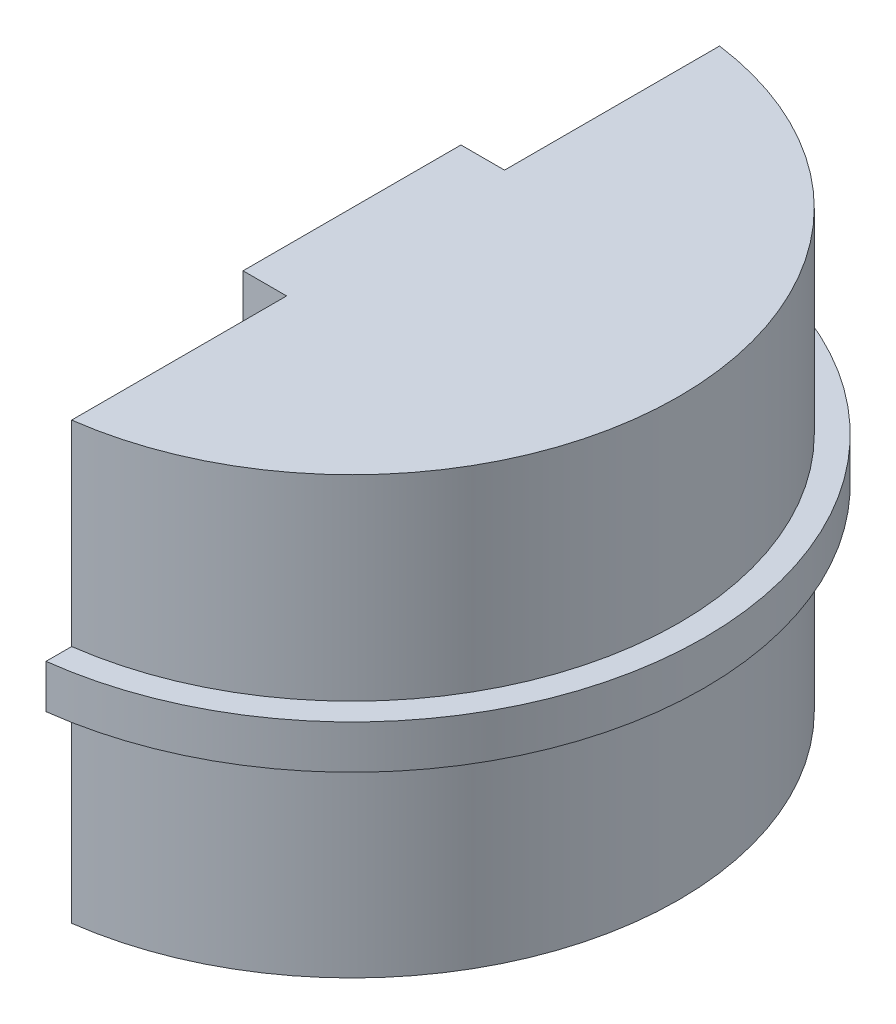
ISO-10303-21;
HEADER;
FILE_DESCRIPTION(('STEP AP214'),'2;1');
FILE_NAME('part.step','',(''),(''),'','','');
FILE_SCHEMA(('AUTOMOTIVE_DESIGN { 1 0 10303 214 1 1 1 1 }'));
ENDSEC;
DATA;
#1=APPLICATION_CONTEXT('core data for automotive mechanical design processes');
#2=APPLICATION_PROTOCOL_DEFINITION('international standard','automotive_design',2000,#1);
#3=PRODUCT_CONTEXT('',#1,'mechanical');
#4=PRODUCT('Part','Part','',(#3));
#5=PRODUCT_RELATED_PRODUCT_CATEGORY('part','',(#4));
#6=PRODUCT_DEFINITION_FORMATION('','',#4);
#7=PRODUCT_DEFINITION_CONTEXT('part definition',#1,'design');
#8=PRODUCT_DEFINITION('design','',#6,#7);
#9=PRODUCT_DEFINITION_SHAPE('','',#8);
#10=(LENGTH_UNIT() NAMED_UNIT(*) SI_UNIT(.MILLI.,.METRE.));
#11=(NAMED_UNIT(*) PLANE_ANGLE_UNIT() SI_UNIT($,.RADIAN.));
#12=(NAMED_UNIT(*) SI_UNIT($,.STERADIAN.) SOLID_ANGLE_UNIT());
#13=UNCERTAINTY_MEASURE_WITH_UNIT(LENGTH_MEASURE(1.E-05),#10,'distance_accuracy_value','');
#14=(GEOMETRIC_REPRESENTATION_CONTEXT(3) GLOBAL_UNCERTAINTY_ASSIGNED_CONTEXT((#13)) GLOBAL_UNIT_ASSIGNED_CONTEXT((#10,
#11,#12)) REPRESENTATION_CONTEXT('',''));
#15=CARTESIAN_POINT('',(0.,0.,0.));
#16=DIRECTION('',(0.,0.,1.));
#17=DIRECTION('',(1.,0.,0.));
#18=AXIS2_PLACEMENT_3D('',#15,#16,#17);
#19=CARTESIAN_POINT('',(-113.861275843542,100.,1.57360546749164));
#20=DIRECTION('',(0.,-1.,0.));
#21=DIRECTION('',(0.,0.,-1.));
#22=AXIS2_PLACEMENT_3D('',#19,#20,#21);
#23=CYLINDRICAL_SURFACE('',#22,75.);
#24=CARTESIAN_POINT('',(-113.861275843542,45.,1.57360546749164));
#25=DIRECTION('',(0.,-1.,0.));
#26=DIRECTION('',(0.,0.,1.));
#27=AXIS2_PLACEMENT_3D('',#24,#25,#26);
#28=CIRCLE('',#27,75.);
#29=CARTESIAN_POINT('',(-103.861275843542,45.,-72.7567382691009));
#30=VERTEX_POINT('',#29);
#31=CARTESIAN_POINT('',(-103.861275843542,45.,75.9039492040842));
#32=VERTEX_POINT('',#31);
#33=EDGE_CURVE('E47',#30,#32,#28,.T.);
#34=ORIENTED_EDGE('',*,*,#33,.T.);
#35=DIRECTION('',(0.,-1.,0.));
#36=VECTOR('',#35,1.);
#37=CARTESIAN_POINT('',(-103.861275843542,100.,75.9039492040842));
#38=LINE('',#37,#36);
#39=CARTESIAN_POINT('',(-103.861275843542,0.,75.9039492040842));
#40=VERTEX_POINT('',#39);
#41=EDGE_CURVE('E121',#32,#40,#38,.T.);
#42=ORIENTED_EDGE('',*,*,#41,.T.);
#43=CARTESIAN_POINT('',(-113.861275843542,0.,1.57360546749164));
#44=DIRECTION('',(0.,1.,0.));
#45=DIRECTION('',(0.,0.,1.));
#46=AXIS2_PLACEMENT_3D('',#43,#44,#45);
#47=CIRCLE('',#46,75.);
#48=CARTESIAN_POINT('',(-103.861275843542,0.,-72.7567382691009));
#49=VERTEX_POINT('',#48);
#50=EDGE_CURVE('E140',#40,#49,#47,.T.);
#51=ORIENTED_EDGE('',*,*,#50,.T.);
#52=DIRECTION('',(0.,-1.,0.));
#53=VECTOR('',#52,1.);
#54=CARTESIAN_POINT('',(-103.861275843542,100.,-72.7567382691009));
#55=LINE('',#54,#53);
#56=EDGE_CURVE('E122',#30,#49,#55,.T.);
#57=ORIENTED_EDGE('',*,*,#56,.F.);
#58=EDGE_LOOP('',(#34,#42,#51,#57));
#59=FACE_BOUND('',#58,.T.);
#60=ADVANCED_FACE('F32',(#59),#23,.T.);
#61=CARTESIAN_POINT('',(-113.861275843542,100.,-23.4263945325084));
#62=DIRECTION('',(1.,0.,0.));
#63=DIRECTION('',(0.,0.,-1.));
#64=AXIS2_PLACEMENT_3D('',#61,#62,#63);
#65=PLANE('',#64);
#66=DIRECTION('',(0.,0.,1.));
#67=VECTOR('',#66,1.);
#68=CARTESIAN_POINT('',(-113.861275843542,0.,-23.4263945325084));
#69=LINE('',#68,#67);
#70=CARTESIAN_POINT('',(-113.861275843542,0.,-23.4263945325084));
#71=VERTEX_POINT('',#70);
#72=CARTESIAN_POINT('',(-113.861275843542,0.,26.5736054674916));
#73=VERTEX_POINT('',#72);
#74=EDGE_CURVE('E131',#71,#73,#69,.T.);
#75=ORIENTED_EDGE('',*,*,#74,.T.);
#76=DIRECTION('',(0.,-1.,0.));
#77=VECTOR('',#76,1.);
#78=CARTESIAN_POINT('',(-113.861275843542,100.,26.5736054674916));
#79=LINE('',#78,#77);
#80=CARTESIAN_POINT('',(-113.861275843542,100.,26.5736054674916));
#81=VERTEX_POINT('',#80);
#82=EDGE_CURVE('E11',#81,#73,#79,.T.);
#83=ORIENTED_EDGE('',*,*,#82,.F.);
#84=DIRECTION('',(0.,0.,1.));
#85=VECTOR('',#84,1.);
#86=CARTESIAN_POINT('',(-113.861275843542,100.,-23.4263945325084));
#87=LINE('',#86,#85);
#88=CARTESIAN_POINT('',(-113.861275843542,100.,-23.4263945325084));
#89=VERTEX_POINT('',#88);
#90=EDGE_CURVE('E146',#89,#81,#87,.T.);
#91=ORIENTED_EDGE('',*,*,#90,.F.);
#92=DIRECTION('',(0.,-1.,0.));
#93=VECTOR('',#92,1.);
#94=CARTESIAN_POINT('',(-113.861275843542,100.,-23.4263945325084));
#95=LINE('',#94,#93);
#96=EDGE_CURVE('E127',#89,#71,#95,.T.);
#97=ORIENTED_EDGE('',*,*,#96,.T.);
#98=EDGE_LOOP('',(#75,#83,#91,#97));
#99=FACE_BOUND('',#98,.T.);
#100=ADVANCED_FACE('F34',(#99),#65,.F.);
#101=CARTESIAN_POINT('',(-113.861275843542,100.,26.5736054674916));
#102=DIRECTION('',(0.,0.,-1.));
#103=DIRECTION('',(-1.,0.,0.));
#104=AXIS2_PLACEMENT_3D('',#101,#102,#103);
#105=PLANE('',#104);
#106=DIRECTION('',(1.,0.,0.));
#107=VECTOR('',#106,1.);
#108=CARTESIAN_POINT('',(-113.861275843542,0.,26.5736054674916));
#109=LINE('',#108,#107);
#110=CARTESIAN_POINT('',(-103.861275843542,0.,26.5736054674916));
#111=VERTEX_POINT('',#110);
#112=EDGE_CURVE('E134',#73,#111,#109,.T.);
#113=ORIENTED_EDGE('',*,*,#112,.T.);
#114=DIRECTION('',(0.,-1.,0.));
#115=VECTOR('',#114,1.);
#116=CARTESIAN_POINT('',(-103.861275843542,100.,26.5736054674916));
#117=LINE('',#116,#115);
#118=CARTESIAN_POINT('',(-103.861275843542,100.,26.5736054674916));
#119=VERTEX_POINT('',#118);
#120=EDGE_CURVE('E40',#119,#111,#117,.T.);
#121=ORIENTED_EDGE('',*,*,#120,.F.);
#122=DIRECTION('',(1.,0.,0.));
#123=VECTOR('',#122,1.);
#124=CARTESIAN_POINT('',(-113.861275843542,100.,26.5736054674916));
#125=LINE('',#124,#123);
#126=EDGE_CURVE('E91',#81,#119,#125,.T.);
#127=ORIENTED_EDGE('',*,*,#126,.F.);
#128=ORIENTED_EDGE('',*,*,#82,.T.);
#129=EDGE_LOOP('',(#113,#121,#127,#128));
#130=FACE_BOUND('',#129,.T.);
#131=ADVANCED_FACE('F204',(#130),#105,.F.);
#132=CARTESIAN_POINT('',(-103.861275843542,100.,26.5736054674916));
#133=DIRECTION('',(1.,0.,0.));
#134=DIRECTION('',(0.,0.,-1.));
#135=AXIS2_PLACEMENT_3D('',#132,#133,#134);
#136=PLANE('',#135);
#137=DIRECTION('',(0.,0.,1.));
#138=VECTOR('',#137,1.);
#139=CARTESIAN_POINT('',(-103.861275843542,0.,26.5736054674916));
#140=LINE('',#139,#138);
#141=EDGE_CURVE('E137',#111,#40,#140,.T.);
#142=ORIENTED_EDGE('',*,*,#141,.T.);
#143=ORIENTED_EDGE('',*,*,#41,.F.);
#144=DIRECTION('',(0.,0.,1.));
#145=VECTOR('',#144,1.);
#146=CARTESIAN_POINT('',(-103.861275843542,45.,75.9039492040842));
#147=LINE('',#146,#145);
#148=CARTESIAN_POINT('',(-103.861275843542,45.,81.7875306623388));
#149=VERTEX_POINT('',#148);
#150=EDGE_CURVE('E166',#32,#149,#147,.T.);
#151=ORIENTED_EDGE('',*,*,#150,.T.);
#152=DIRECTION('',(0.,-1.,0.));
#153=VECTOR('',#152,1.);
#154=CARTESIAN_POINT('',(-103.861275843542,55.,81.7875306623388));
#155=LINE('',#154,#153);
#156=CARTESIAN_POINT('',(-103.861275843542,55.,81.7875306623388));
#157=VERTEX_POINT('',#156);
#158=EDGE_CURVE('E135',#157,#149,#155,.T.);
#159=ORIENTED_EDGE('',*,*,#158,.F.);
#160=DIRECTION('',(0.,0.,1.));
#161=VECTOR('',#160,1.);
#162=CARTESIAN_POINT('',(-103.861275843542,55.,75.9039492040842));
#163=LINE('',#162,#161);
#164=CARTESIAN_POINT('',(-103.861275843542,55.,75.9039492040842));
#165=VERTEX_POINT('',#164);
#166=EDGE_CURVE('E181',#165,#157,#163,.T.);
#167=ORIENTED_EDGE('',*,*,#166,.F.);
#168=CARTESIAN_POINT('',(-103.861275843542,100.,75.9039492040842));
#169=VERTEX_POINT('',#168);
#170=EDGE_CURVE('E149',#169,#165,#38,.T.);
#171=ORIENTED_EDGE('',*,*,#170,.F.);
#172=DIRECTION('',(0.,0.,1.));
#173=VECTOR('',#172,1.);
#174=CARTESIAN_POINT('',(-103.861275843542,100.,26.5736054674916));
#175=LINE('',#174,#173);
#176=EDGE_CURVE('E108',#119,#169,#175,.T.);
#177=ORIENTED_EDGE('',*,*,#176,.F.);
#178=ORIENTED_EDGE('',*,*,#120,.T.);
#179=EDGE_LOOP('',(#142,#143,#151,#159,#167,#171,#177,#178));
#180=FACE_BOUND('',#179,.T.);
#181=ADVANCED_FACE('F153',(#180),#136,.F.);
#182=ORIENTED_EDGE('',*,*,#170,.T.);
#183=CARTESIAN_POINT('',(-113.861275843542,55.,1.57360546749164));
#184=DIRECTION('',(0.,-1.,0.));
#185=DIRECTION('',(0.,0.,1.));
#186=AXIS2_PLACEMENT_3D('',#183,#184,#185);
#187=CIRCLE('',#186,75.);
#188=CARTESIAN_POINT('',(-103.861275843542,55.,-72.7567382691009));
#189=VERTEX_POINT('',#188);
#190=EDGE_CURVE('E118',#189,#165,#187,.T.);
#191=ORIENTED_EDGE('',*,*,#190,.F.);
#192=CARTESIAN_POINT('',(-103.861275843542,100.,-72.7567382691009));
#193=VERTEX_POINT('',#192);
#194=EDGE_CURVE('E115',#193,#189,#55,.T.);
#195=ORIENTED_EDGE('',*,*,#194,.F.);
#196=CARTESIAN_POINT('',(-113.861275843542,100.,1.57360546749164));
#197=DIRECTION('',(0.,1.,0.));
#198=DIRECTION('',(0.,0.,1.));
#199=AXIS2_PLACEMENT_3D('',#196,#197,#198);
#200=CIRCLE('',#199,75.);
#201=EDGE_CURVE('E101',#169,#193,#200,.T.);
#202=ORIENTED_EDGE('',*,*,#201,.F.);
#203=EDGE_LOOP('',(#182,#191,#195,#202));
#204=FACE_BOUND('',#203,.T.);
#205=ADVANCED_FACE('F116',(#204),#23,.T.);
#206=CARTESIAN_POINT('',(-103.861275843542,100.,-23.4263945325084));
#207=DIRECTION('',(1.,0.,0.));
#208=DIRECTION('',(0.,0.,-1.));
#209=AXIS2_PLACEMENT_3D('',#206,#207,#208);
#210=PLANE('',#209);
#211=DIRECTION('',(0.,0.,1.));
#212=VECTOR('',#211,1.);
#213=CARTESIAN_POINT('',(-103.861275843542,0.,-23.4263945325084));
#214=LINE('',#213,#212);
#215=CARTESIAN_POINT('',(-103.861275843542,0.,-23.4263945325084));
#216=VERTEX_POINT('',#215);
#217=EDGE_CURVE('E143',#49,#216,#214,.T.);
#218=ORIENTED_EDGE('',*,*,#217,.T.);
#219=DIRECTION('',(0.,-1.,0.));
#220=VECTOR('',#219,1.);
#221=CARTESIAN_POINT('',(-103.861275843542,100.,-23.4263945325084));
#222=LINE('',#221,#220);
#223=CARTESIAN_POINT('',(-103.861275843542,100.,-23.4263945325084));
#224=VERTEX_POINT('',#223);
#225=EDGE_CURVE('E125',#224,#216,#222,.T.);
#226=ORIENTED_EDGE('',*,*,#225,.F.);
#227=DIRECTION('',(0.,0.,1.));
#228=VECTOR('',#227,1.);
#229=CARTESIAN_POINT('',(-103.861275843542,100.,-23.4263945325084));
#230=LINE('',#229,#228);
#231=EDGE_CURVE('E105',#193,#224,#230,.T.);
#232=ORIENTED_EDGE('',*,*,#231,.F.);
#233=ORIENTED_EDGE('',*,*,#194,.T.);
#234=DIRECTION('',(0.,0.,1.));
#235=VECTOR('',#234,1.);
#236=CARTESIAN_POINT('',(-103.861275843542,55.,-72.7567382691009));
#237=LINE('',#236,#235);
#238=CARTESIAN_POINT('',(-103.861275843542,55.,-78.6403197273555));
#239=VERTEX_POINT('',#238);
#240=EDGE_CURVE('E192',#239,#189,#237,.T.);
#241=ORIENTED_EDGE('',*,*,#240,.F.);
#242=DIRECTION('',(0.,-1.,0.));
#243=VECTOR('',#242,1.);
#244=CARTESIAN_POINT('',(-103.861275843542,55.,-78.6403197273555));
#245=LINE('',#244,#243);
#246=CARTESIAN_POINT('',(-103.861275843542,45.,-78.6403197273555));
#247=VERTEX_POINT('',#246);
#248=EDGE_CURVE('E189',#239,#247,#245,.T.);
#249=ORIENTED_EDGE('',*,*,#248,.T.);
#250=DIRECTION('',(0.,0.,1.));
#251=VECTOR('',#250,1.);
#252=CARTESIAN_POINT('',(-103.861275843542,45.,-72.7567382691009));
#253=LINE('',#252,#251);
#254=EDGE_CURVE('E190',#247,#30,#253,.T.);
#255=ORIENTED_EDGE('',*,*,#254,.T.);
#256=ORIENTED_EDGE('',*,*,#56,.T.);
#257=EDGE_LOOP('',(#218,#226,#232,#233,#241,#249,#255,#256));
#258=FACE_BOUND('',#257,.T.);
#259=ADVANCED_FACE('F124',(#258),#210,.F.);
#260=CARTESIAN_POINT('',(-113.861275843542,100.,-23.4263945325084));
#261=DIRECTION('',(0.,0.,1.));
#262=DIRECTION('',(1.,0.,0.));
#263=AXIS2_PLACEMENT_3D('',#260,#261,#262);
#264=PLANE('',#263);
#265=DIRECTION('',(-1.,0.,0.));
#266=VECTOR('',#265,1.);
#267=CARTESIAN_POINT('',(-113.861275843542,0.,-23.4263945325084));
#268=LINE('',#267,#266);
#269=EDGE_CURVE('E83',#216,#71,#268,.T.);
#270=ORIENTED_EDGE('',*,*,#269,.T.);
#271=ORIENTED_EDGE('',*,*,#96,.F.);
#272=DIRECTION('',(-1.,0.,0.));
#273=VECTOR('',#272,1.);
#274=CARTESIAN_POINT('',(-113.861275843542,100.,-23.4263945325084));
#275=LINE('',#274,#273);
#276=EDGE_CURVE('E56',#224,#89,#275,.T.);
#277=ORIENTED_EDGE('',*,*,#276,.F.);
#278=ORIENTED_EDGE('',*,*,#225,.T.);
#279=EDGE_LOOP('',(#270,#271,#277,#278));
#280=FACE_BOUND('',#279,.T.);
#281=ADVANCED_FACE('F220',(#280),#264,.F.);
#282=CARTESIAN_POINT('',(-113.861275843542,100.,1.57360546749164));
#283=DIRECTION('',(0.,1.,0.));
#284=DIRECTION('',(0.,0.,1.));
#285=AXIS2_PLACEMENT_3D('',#282,#283,#284);
#286=PLANE('',#285);
#287=ORIENTED_EDGE('',*,*,#90,.T.);
#288=ORIENTED_EDGE('',*,*,#126,.T.);
#289=ORIENTED_EDGE('',*,*,#176,.T.);
#290=ORIENTED_EDGE('',*,*,#201,.T.);
#291=ORIENTED_EDGE('',*,*,#231,.T.);
#292=ORIENTED_EDGE('',*,*,#276,.T.);
#293=EDGE_LOOP('',(#287,#288,#289,#290,#291,#292));
#294=FACE_BOUND('',#293,.T.);
#295=ADVANCED_FACE('F103',(#294),#286,.T.);
#296=CARTESIAN_POINT('',(-113.861275843542,0.,1.57360546749164));
#297=DIRECTION('',(0.,1.,0.));
#298=DIRECTION('',(0.,0.,1.));
#299=AXIS2_PLACEMENT_3D('',#296,#297,#298);
#300=PLANE('',#299);
#301=ORIENTED_EDGE('',*,*,#74,.F.);
#302=ORIENTED_EDGE('',*,*,#269,.F.);
#303=ORIENTED_EDGE('',*,*,#217,.F.);
#304=ORIENTED_EDGE('',*,*,#50,.F.);
#305=ORIENTED_EDGE('',*,*,#141,.F.);
#306=ORIENTED_EDGE('',*,*,#112,.F.);
#307=EDGE_LOOP('',(#301,#302,#303,#304,#305,#306));
#308=FACE_BOUND('',#307,.T.);
#309=ADVANCED_FACE('F158',(#308),#300,.F.);
#310=CARTESIAN_POINT('',(-113.861275843542,55.,1.57360546749164));
#311=DIRECTION('',(0.,-1.,0.));
#312=DIRECTION('',(0.,0.,-1.));
#313=AXIS2_PLACEMENT_3D('',#310,#311,#312);
#314=CYLINDRICAL_SURFACE('',#313,80.8348550760409);
#315=CARTESIAN_POINT('',(-113.861275843542,45.,1.57360546749164));
#316=DIRECTION('',(0.,1.,0.));
#317=DIRECTION('',(0.,0.,1.));
#318=AXIS2_PLACEMENT_3D('',#315,#316,#317);
#319=CIRCLE('',#318,80.8348550760409);
#320=EDGE_CURVE('E185',#149,#247,#319,.T.);
#321=ORIENTED_EDGE('',*,*,#320,.T.);
#322=ORIENTED_EDGE('',*,*,#248,.F.);
#323=CARTESIAN_POINT('',(-113.861275843542,55.,1.57360546749164));
#324=DIRECTION('',(0.,1.,0.));
#325=DIRECTION('',(0.,0.,1.));
#326=AXIS2_PLACEMENT_3D('',#323,#324,#325);
#327=CIRCLE('',#326,80.8348550760409);
#328=EDGE_CURVE('E239',#157,#239,#327,.T.);
#329=ORIENTED_EDGE('',*,*,#328,.F.);
#330=ORIENTED_EDGE('',*,*,#158,.T.);
#331=EDGE_LOOP('',(#321,#322,#329,#330));
#332=FACE_BOUND('',#331,.T.);
#333=ADVANCED_FACE('F187',(#332),#314,.T.);
#334=CARTESIAN_POINT('',(-113.861275843542,55.,1.57360546749164));
#335=DIRECTION('',(0.,1.,0.));
#336=DIRECTION('',(0.,0.,1.));
#337=AXIS2_PLACEMENT_3D('',#334,#335,#336);
#338=PLANE('',#337);
#339=ORIENTED_EDGE('',*,*,#190,.T.);
#340=ORIENTED_EDGE('',*,*,#166,.T.);
#341=ORIENTED_EDGE('',*,*,#328,.T.);
#342=ORIENTED_EDGE('',*,*,#240,.T.);
#343=EDGE_LOOP('',(#339,#340,#341,#342));
#344=FACE_BOUND('',#343,.T.);
#345=ADVANCED_FACE('F232',(#344),#338,.T.);
#346=CARTESIAN_POINT('',(-113.861275843542,45.,1.57360546749164));
#347=DIRECTION('',(0.,1.,0.));
#348=DIRECTION('',(0.,0.,1.));
#349=AXIS2_PLACEMENT_3D('',#346,#347,#348);
#350=PLANE('',#349);
#351=ORIENTED_EDGE('',*,*,#33,.F.);
#352=ORIENTED_EDGE('',*,*,#254,.F.);
#353=ORIENTED_EDGE('',*,*,#320,.F.);
#354=ORIENTED_EDGE('',*,*,#150,.F.);
#355=EDGE_LOOP('',(#351,#352,#353,#354));
#356=FACE_BOUND('',#355,.T.);
#357=ADVANCED_FACE('F194',(#356),#350,.F.);
#358=CLOSED_SHELL('',(#60,#100,#131,#181,#205,#259,#281,#295,#309,#333,#345,#357));
#359=MANIFOLD_SOLID_BREP('B2',#358);
#360=ADVANCED_BREP_SHAPE_REPRESENTATION('',(#18,#359),#14);
#361=SHAPE_DEFINITION_REPRESENTATION(#9,#360);
ENDSEC;
END-ISO-10303-21;
